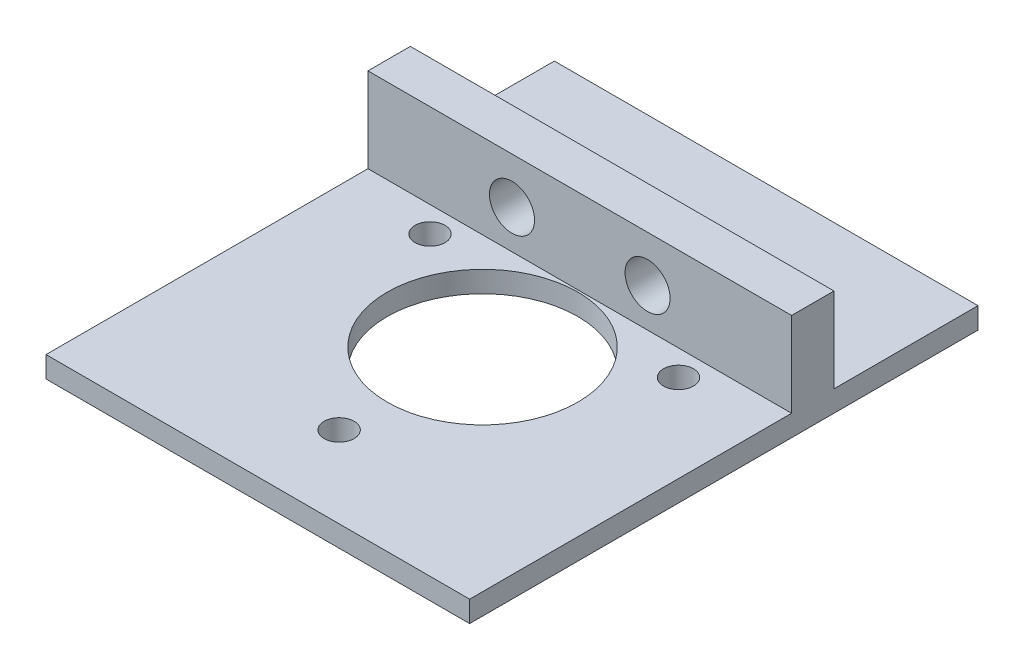
ISO-10303-21;
HEADER;
FILE_DESCRIPTION(('STEP AP214'),'2;1');
FILE_NAME('part.step','',(''),(''),'','','');
FILE_SCHEMA(('AUTOMOTIVE_DESIGN { 1 0 10303 214 1 1 1 1 }'));
ENDSEC;
DATA;
#1=APPLICATION_CONTEXT('core data for automotive mechanical design processes');
#2=APPLICATION_PROTOCOL_DEFINITION('international standard','automotive_design',2000,#1);
#3=PRODUCT_CONTEXT('',#1,'mechanical');
#4=PRODUCT('Part','Part','',(#3));
#5=PRODUCT_RELATED_PRODUCT_CATEGORY('part','',(#4));
#6=PRODUCT_DEFINITION_FORMATION('','',#4);
#7=PRODUCT_DEFINITION_CONTEXT('part definition',#1,'design');
#8=PRODUCT_DEFINITION('design','',#6,#7);
#9=PRODUCT_DEFINITION_SHAPE('','',#8);
#10=(LENGTH_UNIT() NAMED_UNIT(*) SI_UNIT(.MILLI.,.METRE.));
#11=(NAMED_UNIT(*) PLANE_ANGLE_UNIT() SI_UNIT($,.RADIAN.));
#12=(NAMED_UNIT(*) SI_UNIT($,.STERADIAN.) SOLID_ANGLE_UNIT());
#13=UNCERTAINTY_MEASURE_WITH_UNIT(LENGTH_MEASURE(1.E-05),#10,'distance_accuracy_value','');
#14=(GEOMETRIC_REPRESENTATION_CONTEXT(3) GLOBAL_UNCERTAINTY_ASSIGNED_CONTEXT((#13)) GLOBAL_UNIT_ASSIGNED_CONTEXT((#10,
#11,#12)) REPRESENTATION_CONTEXT('',''));
#15=CARTESIAN_POINT('',(0.,0.,0.));
#16=DIRECTION('',(0.,0.,1.));
#17=DIRECTION('',(1.,0.,0.));
#18=AXIS2_PLACEMENT_3D('',#15,#16,#17);
#19=CARTESIAN_POINT('',(63.5,0.,-76.2));
#20=DIRECTION('',(0.,1.,0.));
#21=DIRECTION('',(0.,0.,1.));
#22=AXIS2_PLACEMENT_3D('',#19,#20,#21);
#23=PLANE('',#22);
#24=CARTESIAN_POINT('',(31.75,0.,-12.1855537131404));
#25=DIRECTION('',(0.,-1.,0.));
#26=DIRECTION('',(0.,0.,-1.));
#27=AXIS2_PLACEMENT_3D('',#24,#25,#26);
#28=CIRCLE('',#27,2.25);
#29=CARTESIAN_POINT('',(31.75,0.,-14.4355537131404));
#30=VERTEX_POINT('',#29);
#31=EDGE_CURVE('E178',#30,#30,#28,.T.);
#32=ORIENTED_EDGE('',*,*,#31,.F.);
#33=EDGE_LOOP('',(#32));
#34=FACE_BOUND('',#33,.T.);
#35=CARTESIAN_POINT('',(50.36954618137,0.,-44.4355537131404));
#36=DIRECTION('',(0.,-1.,0.));
#37=DIRECTION('',(0.,0.,-1.));
#38=AXIS2_PLACEMENT_3D('',#35,#36,#37);
#39=CIRCLE('',#38,2.25);
#40=CARTESIAN_POINT('',(50.36954618137,0.,-46.6855537131404));
#41=VERTEX_POINT('',#40);
#42=EDGE_CURVE('E168',#41,#41,#39,.T.);
#43=ORIENTED_EDGE('',*,*,#42,.F.);
#44=EDGE_LOOP('',(#43));
#45=FACE_BOUND('',#44,.T.);
#46=CARTESIAN_POINT('',(13.13045381863,0.,-44.4355537131404));
#47=DIRECTION('',(0.,-1.,0.));
#48=DIRECTION('',(0.,0.,-1.));
#49=AXIS2_PLACEMENT_3D('',#46,#47,#48);
#50=CIRCLE('',#49,2.25);
#51=CARTESIAN_POINT('',(13.13045381863,0.,-46.6855537131404));
#52=VERTEX_POINT('',#51);
#53=EDGE_CURVE('E165',#52,#52,#50,.T.);
#54=ORIENTED_EDGE('',*,*,#53,.F.);
#55=EDGE_LOOP('',(#54));
#56=FACE_BOUND('',#55,.T.);
#57=CARTESIAN_POINT('',(31.75,0.,-33.6855537131404));
#58=DIRECTION('',(0.,1.,0.));
#59=DIRECTION('',(0.,0.,1.));
#60=AXIS2_PLACEMENT_3D('',#57,#58,#59);
#61=CIRCLE('',#60,14.2875);
#62=CARTESIAN_POINT('',(31.75,0.,-19.3980537131404));
#63=VERTEX_POINT('',#62);
#64=EDGE_CURVE('E139',#63,#63,#61,.T.);
#65=ORIENTED_EDGE('',*,*,#64,.T.);
#66=EDGE_LOOP('',(#65));
#67=FACE_BOUND('',#66,.T.);
#68=DIRECTION('',(0.,0.,-1.));
#69=VECTOR('',#68,1.);
#70=CARTESIAN_POINT('',(0.,0.,-76.2));
#71=LINE('',#70,#69);
#72=CARTESIAN_POINT('',(0.,0.,0.));
#73=VERTEX_POINT('',#72);
#74=CARTESIAN_POINT('',(0.,0.,-76.2));
#75=VERTEX_POINT('',#74);
#76=EDGE_CURVE('E135',#73,#75,#71,.T.);
#77=ORIENTED_EDGE('',*,*,#76,.T.);
#78=DIRECTION('',(-1.,0.,0.));
#79=VECTOR('',#78,1.);
#80=CARTESIAN_POINT('',(63.5,0.,-76.2));
#81=LINE('',#80,#79);
#82=CARTESIAN_POINT('',(63.5,0.,-76.2));
#83=VERTEX_POINT('',#82);
#84=EDGE_CURVE('E11',#83,#75,#81,.T.);
#85=ORIENTED_EDGE('',*,*,#84,.F.);
#86=DIRECTION('',(0.,0.,-1.));
#87=VECTOR('',#86,1.);
#88=CARTESIAN_POINT('',(63.5,0.,-76.2));
#89=LINE('',#88,#87);
#90=CARTESIAN_POINT('',(63.5,0.,0.));
#91=VERTEX_POINT('',#90);
#92=EDGE_CURVE('E150',#91,#83,#89,.T.);
#93=ORIENTED_EDGE('',*,*,#92,.F.);
#94=DIRECTION('',(-1.,0.,0.));
#95=VECTOR('',#94,1.);
#96=CARTESIAN_POINT('',(63.5,0.,0.));
#97=LINE('',#96,#95);
#98=EDGE_CURVE('E131',#91,#73,#97,.T.);
#99=ORIENTED_EDGE('',*,*,#98,.T.);
#100=EDGE_LOOP('',(#77,#85,#93,#99));
#101=FACE_BOUND('',#100,.T.);
#102=ADVANCED_FACE('F37',(#34,#45,#56,#67,#101),#23,.F.);
#103=CARTESIAN_POINT('',(63.5,3.175,-76.2));
#104=DIRECTION('',(0.,0.,1.));
#105=DIRECTION('',(1.,0.,0.));
#106=AXIS2_PLACEMENT_3D('',#103,#104,#105);
#107=PLANE('',#106);
#108=DIRECTION('',(0.,1.,0.));
#109=VECTOR('',#108,1.);
#110=CARTESIAN_POINT('',(0.,3.175,-76.2));
#111=LINE('',#110,#109);
#112=CARTESIAN_POINT('',(0.,3.175,-76.2));
#113=VERTEX_POINT('',#112);
#114=EDGE_CURVE('E138',#75,#113,#111,.T.);
#115=ORIENTED_EDGE('',*,*,#114,.T.);
#116=DIRECTION('',(-1.,0.,0.));
#117=VECTOR('',#116,1.);
#118=CARTESIAN_POINT('',(63.5,3.175,-76.2));
#119=LINE('',#118,#117);
#120=CARTESIAN_POINT('',(63.5,3.175,-76.2));
#121=VERTEX_POINT('',#120);
#122=EDGE_CURVE('E46',#121,#113,#119,.T.);
#123=ORIENTED_EDGE('',*,*,#122,.F.);
#124=DIRECTION('',(0.,1.,0.));
#125=VECTOR('',#124,1.);
#126=CARTESIAN_POINT('',(63.5,3.175,-76.2));
#127=LINE('',#126,#125);
#128=EDGE_CURVE('E98',#83,#121,#127,.T.);
#129=ORIENTED_EDGE('',*,*,#128,.F.);
#130=ORIENTED_EDGE('',*,*,#84,.T.);
#131=EDGE_LOOP('',(#115,#123,#129,#130));
#132=FACE_BOUND('',#131,.T.);
#133=ADVANCED_FACE('F220',(#132),#107,.F.);
#134=CARTESIAN_POINT('',(63.5,3.175,-54.61));
#135=DIRECTION('',(0.,-1.,0.));
#136=DIRECTION('',(0.,0.,-1.));
#137=AXIS2_PLACEMENT_3D('',#134,#135,#136);
#138=PLANE('',#137);
#139=DIRECTION('',(0.,0.,1.));
#140=VECTOR('',#139,1.);
#141=CARTESIAN_POINT('',(0.,3.175,-54.61));
#142=LINE('',#141,#140);
#143=CARTESIAN_POINT('',(0.,3.175,-54.61));
#144=VERTEX_POINT('',#143);
#145=EDGE_CURVE('E141',#113,#144,#142,.T.);
#146=ORIENTED_EDGE('',*,*,#145,.T.);
#147=DIRECTION('',(-1.,0.,0.));
#148=VECTOR('',#147,1.);
#149=CARTESIAN_POINT('',(63.5,3.175,-54.61));
#150=LINE('',#149,#148);
#151=CARTESIAN_POINT('',(63.5,3.175,-54.61));
#152=VERTEX_POINT('',#151);
#153=EDGE_CURVE('E157',#152,#144,#150,.T.);
#154=ORIENTED_EDGE('',*,*,#153,.F.);
#155=DIRECTION('',(0.,0.,1.));
#156=VECTOR('',#155,1.);
#157=CARTESIAN_POINT('',(63.5,3.175,-54.61));
#158=LINE('',#157,#156);
#159=EDGE_CURVE('E188',#121,#152,#158,.T.);
#160=ORIENTED_EDGE('',*,*,#159,.F.);
#161=ORIENTED_EDGE('',*,*,#122,.T.);
#162=EDGE_LOOP('',(#146,#154,#160,#161));
#163=FACE_BOUND('',#162,.T.);
#164=ADVANCED_FACE('F225',(#163),#138,.F.);
#165=CARTESIAN_POINT('',(63.5,15.875,-54.61));
#166=DIRECTION('',(0.,0.,1.));
#167=DIRECTION('',(1.,0.,0.));
#168=AXIS2_PLACEMENT_3D('',#165,#166,#167);
#169=PLANE('',#168);
#170=CARTESIAN_POINT('',(41.91,8.96619999999999,-54.61));
#171=DIRECTION('',(0.,0.,1.));
#172=DIRECTION('',(1.,0.,0.));
#173=AXIS2_PLACEMENT_3D('',#170,#171,#172);
#174=CIRCLE('',#173,3.37819999999999);
#175=CARTESIAN_POINT('',(45.2882,8.96619999999999,-54.61));
#176=VERTEX_POINT('',#175);
#177=EDGE_CURVE('E270',#176,#176,#174,.T.);
#178=ORIENTED_EDGE('',*,*,#177,.T.);
#179=EDGE_LOOP('',(#178));
#180=FACE_BOUND('',#179,.T.);
#181=CARTESIAN_POINT('',(21.59,8.96619999999999,-54.61));
#182=DIRECTION('',(0.,0.,1.));
#183=DIRECTION('',(1.,0.,0.));
#184=AXIS2_PLACEMENT_3D('',#181,#182,#183);
#185=CIRCLE('',#184,3.3782);
#186=CARTESIAN_POINT('',(24.9682,8.96619999999999,-54.61));
#187=VERTEX_POINT('',#186);
#188=EDGE_CURVE('E275',#187,#187,#185,.T.);
#189=ORIENTED_EDGE('',*,*,#188,.T.);
#190=EDGE_LOOP('',(#189));
#191=FACE_BOUND('',#190,.T.);
#192=DIRECTION('',(0.,1.,0.));
#193=VECTOR('',#192,1.);
#194=CARTESIAN_POINT('',(0.,15.875,-54.61));
#195=LINE('',#194,#193);
#196=CARTESIAN_POINT('',(0.,15.875,-54.61));
#197=VERTEX_POINT('',#196);
#198=EDGE_CURVE('E143',#144,#197,#195,.T.);
#199=ORIENTED_EDGE('',*,*,#198,.T.);
#200=DIRECTION('',(-1.,0.,0.));
#201=VECTOR('',#200,1.);
#202=CARTESIAN_POINT('',(63.5,15.875,-54.61));
#203=LINE('',#202,#201);
#204=CARTESIAN_POINT('',(63.5,15.875,-54.61));
#205=VERTEX_POINT('',#204);
#206=EDGE_CURVE('E154',#205,#197,#203,.T.);
#207=ORIENTED_EDGE('',*,*,#206,.F.);
#208=DIRECTION('',(0.,1.,0.));
#209=VECTOR('',#208,1.);
#210=CARTESIAN_POINT('',(63.5,15.875,-54.61));
#211=LINE('',#210,#209);
#212=EDGE_CURVE('E190',#152,#205,#211,.T.);
#213=ORIENTED_EDGE('',*,*,#212,.F.);
#214=ORIENTED_EDGE('',*,*,#153,.T.);
#215=EDGE_LOOP('',(#199,#207,#213,#214));
#216=FACE_BOUND('',#215,.T.);
#217=ADVANCED_FACE('F196',(#180,#191,#216),#169,.F.);
#218=CARTESIAN_POINT('',(63.5,15.875,-48.26));
#219=DIRECTION('',(0.,-1.,0.));
#220=DIRECTION('',(0.,0.,-1.));
#221=AXIS2_PLACEMENT_3D('',#218,#219,#220);
#222=PLANE('',#221);
#223=DIRECTION('',(0.,0.,1.));
#224=VECTOR('',#223,1.);
#225=CARTESIAN_POINT('',(0.,15.875,-48.26));
#226=LINE('',#225,#224);
#227=CARTESIAN_POINT('',(0.,15.875,-48.26));
#228=VERTEX_POINT('',#227);
#229=EDGE_CURVE('E145',#197,#228,#226,.T.);
#230=ORIENTED_EDGE('',*,*,#229,.T.);
#231=DIRECTION('',(-1.,0.,0.));
#232=VECTOR('',#231,1.);
#233=CARTESIAN_POINT('',(63.5,15.875,-48.26));
#234=LINE('',#233,#232);
#235=CARTESIAN_POINT('',(63.5,15.875,-48.26));
#236=VERTEX_POINT('',#235);
#237=EDGE_CURVE('E126',#236,#228,#234,.T.);
#238=ORIENTED_EDGE('',*,*,#237,.F.);
#239=DIRECTION('',(0.,0.,1.));
#240=VECTOR('',#239,1.);
#241=CARTESIAN_POINT('',(63.5,15.875,-48.26));
#242=LINE('',#241,#240);
#243=EDGE_CURVE('E117',#205,#236,#242,.T.);
#244=ORIENTED_EDGE('',*,*,#243,.F.);
#245=ORIENTED_EDGE('',*,*,#206,.T.);
#246=EDGE_LOOP('',(#230,#238,#244,#245));
#247=FACE_BOUND('',#246,.T.);
#248=ADVANCED_FACE('F200',(#247),#222,.F.);
#249=CARTESIAN_POINT('',(63.5,3.17500000000001,-48.26));
#250=DIRECTION('',(0.,0.,-1.));
#251=DIRECTION('',(-1.,0.,0.));
#252=AXIS2_PLACEMENT_3D('',#249,#250,#251);
#253=PLANE('',#252);
#254=CARTESIAN_POINT('',(41.91,8.96619999999999,-48.26));
#255=DIRECTION('',(0.,0.,1.));
#256=DIRECTION('',(1.,0.,0.));
#257=AXIS2_PLACEMENT_3D('',#254,#255,#256);
#258=CIRCLE('',#257,3.3782);
#259=CARTESIAN_POINT('',(45.2882,8.96619999999999,-48.26));
#260=VERTEX_POINT('',#259);
#261=EDGE_CURVE('E267',#260,#260,#258,.T.);
#262=ORIENTED_EDGE('',*,*,#261,.F.);
#263=EDGE_LOOP('',(#262));
#264=FACE_BOUND('',#263,.T.);
#265=CARTESIAN_POINT('',(21.59,8.96619999999999,-48.26));
#266=DIRECTION('',(0.,0.,1.));
#267=DIRECTION('',(1.,0.,0.));
#268=AXIS2_PLACEMENT_3D('',#265,#266,#267);
#269=CIRCLE('',#268,3.3782);
#270=CARTESIAN_POINT('',(24.9682,8.96619999999999,-48.26));
#271=VERTEX_POINT('',#270);
#272=EDGE_CURVE('E272',#271,#271,#269,.T.);
#273=ORIENTED_EDGE('',*,*,#272,.F.);
#274=EDGE_LOOP('',(#273));
#275=FACE_BOUND('',#274,.T.);
#276=DIRECTION('',(0.,-1.,0.));
#277=VECTOR('',#276,1.);
#278=CARTESIAN_POINT('',(0.,3.17500000000001,-48.26));
#279=LINE('',#278,#277);
#280=CARTESIAN_POINT('',(0.,3.17500000000001,-48.26));
#281=VERTEX_POINT('',#280);
#282=EDGE_CURVE('E125',#228,#281,#279,.T.);
#283=ORIENTED_EDGE('',*,*,#282,.T.);
#284=DIRECTION('',(-1.,0.,0.));
#285=VECTOR('',#284,1.);
#286=CARTESIAN_POINT('',(63.5,3.17500000000001,-48.26));
#287=LINE('',#286,#285);
#288=CARTESIAN_POINT('',(63.5,3.17500000000001,-48.26));
#289=VERTEX_POINT('',#288);
#290=EDGE_CURVE('E122',#289,#281,#287,.T.);
#291=ORIENTED_EDGE('',*,*,#290,.F.);
#292=DIRECTION('',(0.,-1.,0.));
#293=VECTOR('',#292,1.);
#294=CARTESIAN_POINT('',(63.5,3.17500000000001,-48.26));
#295=LINE('',#294,#293);
#296=EDGE_CURVE('E111',#236,#289,#295,.T.);
#297=ORIENTED_EDGE('',*,*,#296,.F.);
#298=ORIENTED_EDGE('',*,*,#237,.T.);
#299=EDGE_LOOP('',(#283,#291,#297,#298));
#300=FACE_BOUND('',#299,.T.);
#301=ADVANCED_FACE('F123',(#264,#275,#300),#253,.F.);
#302=CARTESIAN_POINT('',(63.5,3.175,0.));
#303=DIRECTION('',(0.,-1.,0.));
#304=DIRECTION('',(0.,0.,-1.));
#305=AXIS2_PLACEMENT_3D('',#302,#303,#304);
#306=PLANE('',#305);
#307=CARTESIAN_POINT('',(31.75,3.175,-12.1855537131404));
#308=DIRECTION('',(0.,-1.,0.));
#309=DIRECTION('',(0.,0.,-1.));
#310=AXIS2_PLACEMENT_3D('',#307,#308,#309);
#311=CIRCLE('',#310,2.25);
#312=CARTESIAN_POINT('',(31.75,3.175,-14.4355537131404));
#313=VERTEX_POINT('',#312);
#314=EDGE_CURVE('E40',#313,#313,#311,.T.);
#315=ORIENTED_EDGE('',*,*,#314,.T.);
#316=EDGE_LOOP('',(#315));
#317=FACE_BOUND('',#316,.T.);
#318=CARTESIAN_POINT('',(50.36954618137,3.17500000000001,-44.4355537131404));
#319=DIRECTION('',(0.,-1.,0.));
#320=DIRECTION('',(0.,0.,-1.));
#321=AXIS2_PLACEMENT_3D('',#318,#319,#320);
#322=CIRCLE('',#321,2.25);
#323=CARTESIAN_POINT('',(50.36954618137,3.17500000000001,-46.6855537131404));
#324=VERTEX_POINT('',#323);
#325=EDGE_CURVE('E166',#324,#324,#322,.T.);
#326=ORIENTED_EDGE('',*,*,#325,.T.);
#327=EDGE_LOOP('',(#326));
#328=FACE_BOUND('',#327,.T.);
#329=CARTESIAN_POINT('',(13.13045381863,3.17500000000001,-44.4355537131404));
#330=DIRECTION('',(0.,-1.,0.));
#331=DIRECTION('',(0.,0.,-1.));
#332=AXIS2_PLACEMENT_3D('',#329,#330,#331);
#333=CIRCLE('',#332,2.25);
#334=CARTESIAN_POINT('',(13.13045381863,3.17500000000001,-46.6855537131404));
#335=VERTEX_POINT('',#334);
#336=EDGE_CURVE('E162',#335,#335,#333,.T.);
#337=ORIENTED_EDGE('',*,*,#336,.T.);
#338=EDGE_LOOP('',(#337));
#339=FACE_BOUND('',#338,.T.);
#340=CARTESIAN_POINT('',(31.75,3.175,-33.6855537131404));
#341=DIRECTION('',(0.,1.,0.));
#342=DIRECTION('',(0.,0.,1.));
#343=AXIS2_PLACEMENT_3D('',#340,#341,#342);
#344=CIRCLE('',#343,14.2875);
#345=CARTESIAN_POINT('',(31.75,3.175,-19.3980537131404));
#346=VERTEX_POINT('',#345);
#347=EDGE_CURVE('E164',#346,#346,#344,.T.);
#348=ORIENTED_EDGE('',*,*,#347,.F.);
#349=EDGE_LOOP('',(#348));
#350=FACE_BOUND('',#349,.T.);
#351=DIRECTION('',(0.,0.,1.));
#352=VECTOR('',#351,1.);
#353=CARTESIAN_POINT('',(0.,3.175,0.));
#354=LINE('',#353,#352);
#355=CARTESIAN_POINT('',(0.,3.175,0.));
#356=VERTEX_POINT('',#355);
#357=EDGE_CURVE('E84',#281,#356,#354,.T.);
#358=ORIENTED_EDGE('',*,*,#357,.T.);
#359=DIRECTION('',(-1.,0.,0.));
#360=VECTOR('',#359,1.);
#361=CARTESIAN_POINT('',(63.5,3.175,0.));
#362=LINE('',#361,#360);
#363=CARTESIAN_POINT('',(63.5,3.175,0.));
#364=VERTEX_POINT('',#363);
#365=EDGE_CURVE('E127',#364,#356,#362,.T.);
#366=ORIENTED_EDGE('',*,*,#365,.F.);
#367=DIRECTION('',(0.,0.,1.));
#368=VECTOR('',#367,1.);
#369=CARTESIAN_POINT('',(63.5,3.175,0.));
#370=LINE('',#369,#368);
#371=EDGE_CURVE('E115',#289,#364,#370,.T.);
#372=ORIENTED_EDGE('',*,*,#371,.F.);
#373=ORIENTED_EDGE('',*,*,#290,.T.);
#374=EDGE_LOOP('',(#358,#366,#372,#373));
#375=FACE_BOUND('',#374,.T.);
#376=ADVANCED_FACE('F129',(#317,#328,#339,#350,#375),#306,.F.);
#377=CARTESIAN_POINT('',(63.5,0.,0.));
#378=DIRECTION('',(0.,0.,-1.));
#379=DIRECTION('',(-1.,0.,0.));
#380=AXIS2_PLACEMENT_3D('',#377,#378,#379);
#381=PLANE('',#380);
#382=DIRECTION('',(0.,-1.,0.));
#383=VECTOR('',#382,1.);
#384=CARTESIAN_POINT('',(0.,0.,0.));
#385=LINE('',#384,#383);
#386=EDGE_CURVE('E90',#356,#73,#385,.T.);
#387=ORIENTED_EDGE('',*,*,#386,.T.);
#388=ORIENTED_EDGE('',*,*,#98,.F.);
#389=DIRECTION('',(0.,-1.,0.));
#390=VECTOR('',#389,1.);
#391=CARTESIAN_POINT('',(63.5,0.,0.));
#392=LINE('',#391,#390);
#393=EDGE_CURVE('E55',#364,#91,#392,.T.);
#394=ORIENTED_EDGE('',*,*,#393,.F.);
#395=ORIENTED_EDGE('',*,*,#365,.T.);
#396=EDGE_LOOP('',(#387,#388,#394,#395));
#397=FACE_BOUND('',#396,.T.);
#398=ADVANCED_FACE('F208',(#397),#381,.F.);
#399=CARTESIAN_POINT('',(63.5,0.,0.));
#400=DIRECTION('',(-1.,0.,0.));
#401=DIRECTION('',(0.,0.,1.));
#402=AXIS2_PLACEMENT_3D('',#399,#400,#401);
#403=PLANE('',#402);
#404=ORIENTED_EDGE('',*,*,#92,.T.);
#405=ORIENTED_EDGE('',*,*,#128,.T.);
#406=ORIENTED_EDGE('',*,*,#159,.T.);
#407=ORIENTED_EDGE('',*,*,#212,.T.);
#408=ORIENTED_EDGE('',*,*,#243,.T.);
#409=ORIENTED_EDGE('',*,*,#296,.T.);
#410=ORIENTED_EDGE('',*,*,#371,.T.);
#411=ORIENTED_EDGE('',*,*,#393,.T.);
#412=EDGE_LOOP('',(#404,#405,#406,#407,#408,#409,#410,#411));
#413=FACE_BOUND('',#412,.T.);
#414=ADVANCED_FACE('F113',(#413),#403,.F.);
#415=CARTESIAN_POINT('',(0.,0.,0.));
#416=DIRECTION('',(-1.,0.,0.));
#417=DIRECTION('',(0.,0.,1.));
#418=AXIS2_PLACEMENT_3D('',#415,#416,#417);
#419=PLANE('',#418);
#420=ORIENTED_EDGE('',*,*,#76,.F.);
#421=ORIENTED_EDGE('',*,*,#386,.F.);
#422=ORIENTED_EDGE('',*,*,#357,.F.);
#423=ORIENTED_EDGE('',*,*,#282,.F.);
#424=ORIENTED_EDGE('',*,*,#229,.F.);
#425=ORIENTED_EDGE('',*,*,#198,.F.);
#426=ORIENTED_EDGE('',*,*,#145,.F.);
#427=ORIENTED_EDGE('',*,*,#114,.F.);
#428=EDGE_LOOP('',(#420,#421,#422,#423,#424,#425,#426,#427));
#429=FACE_BOUND('',#428,.T.);
#430=ADVANCED_FACE('F203',(#429),#419,.T.);
#431=CARTESIAN_POINT('',(31.75,0.,-33.6855537131404));
#432=DIRECTION('',(0.,1.,0.));
#433=DIRECTION('',(0.,0.,1.));
#434=AXIS2_PLACEMENT_3D('',#431,#432,#433);
#435=CYLINDRICAL_SURFACE('',#434,14.2875);
#436=ORIENTED_EDGE('',*,*,#64,.F.);
#437=EDGE_LOOP('',(#436));
#438=FACE_BOUND('',#437,.T.);
#439=ORIENTED_EDGE('',*,*,#347,.T.);
#440=EDGE_LOOP('',(#439));
#441=FACE_BOUND('',#440,.T.);
#442=ADVANCED_FACE('F234',(#438,#441),#435,.F.);
#443=CARTESIAN_POINT('',(13.13045381863,0.,-44.4355537131404));
#444=DIRECTION('',(0.,-1.,0.));
#445=DIRECTION('',(0.,0.,-1.));
#446=AXIS2_PLACEMENT_3D('',#443,#444,#445);
#447=CYLINDRICAL_SURFACE('',#446,2.25);
#448=ORIENTED_EDGE('',*,*,#53,.T.);
#449=EDGE_LOOP('',(#448));
#450=FACE_BOUND('',#449,.T.);
#451=ORIENTED_EDGE('',*,*,#336,.F.);
#452=EDGE_LOOP('',(#451));
#453=FACE_BOUND('',#452,.T.);
#454=ADVANCED_FACE('F237',(#450,#453),#447,.F.);
#455=CARTESIAN_POINT('',(50.36954618137,0.,-44.4355537131404));
#456=DIRECTION('',(0.,-1.,0.));
#457=DIRECTION('',(0.,0.,-1.));
#458=AXIS2_PLACEMENT_3D('',#455,#456,#457);
#459=CYLINDRICAL_SURFACE('',#458,2.25);
#460=ORIENTED_EDGE('',*,*,#42,.T.);
#461=EDGE_LOOP('',(#460));
#462=FACE_BOUND('',#461,.T.);
#463=ORIENTED_EDGE('',*,*,#325,.F.);
#464=EDGE_LOOP('',(#463));
#465=FACE_BOUND('',#464,.T.);
#466=ADVANCED_FACE('F245',(#462,#465),#459,.F.);
#467=CARTESIAN_POINT('',(31.75,0.,-12.1855537131404));
#468=DIRECTION('',(0.,-1.,0.));
#469=DIRECTION('',(0.,0.,-1.));
#470=AXIS2_PLACEMENT_3D('',#467,#468,#469);
#471=CYLINDRICAL_SURFACE('',#470,2.25);
#472=ORIENTED_EDGE('',*,*,#31,.T.);
#473=EDGE_LOOP('',(#472));
#474=FACE_BOUND('',#473,.T.);
#475=ORIENTED_EDGE('',*,*,#314,.F.);
#476=EDGE_LOOP('',(#475));
#477=FACE_BOUND('',#476,.T.);
#478=ADVANCED_FACE('F251',(#474,#477),#471,.F.);
#479=CARTESIAN_POINT('',(21.59,8.96619999999999,-48.26));
#480=DIRECTION('',(0.,0.,1.));
#481=DIRECTION('',(1.,0.,0.));
#482=AXIS2_PLACEMENT_3D('',#479,#480,#481);
#483=CYLINDRICAL_SURFACE('',#482,3.3782);
#484=ORIENTED_EDGE('',*,*,#272,.T.);
#485=EDGE_LOOP('',(#484));
#486=FACE_BOUND('',#485,.T.);
#487=ORIENTED_EDGE('',*,*,#188,.F.);
#488=EDGE_LOOP('',(#487));
#489=FACE_BOUND('',#488,.T.);
#490=ADVANCED_FACE('F254',(#486,#489),#483,.F.);
#491=CARTESIAN_POINT('',(41.91,8.96619999999999,-48.26));
#492=DIRECTION('',(0.,0.,1.));
#493=DIRECTION('',(1.,0.,0.));
#494=AXIS2_PLACEMENT_3D('',#491,#492,#493);
#495=CYLINDRICAL_SURFACE('',#494,3.37819999999999);
#496=ORIENTED_EDGE('',*,*,#261,.T.);
#497=EDGE_LOOP('',(#496));
#498=FACE_BOUND('',#497,.T.);
#499=ORIENTED_EDGE('',*,*,#177,.F.);
#500=EDGE_LOOP('',(#499));
#501=FACE_BOUND('',#500,.T.);
#502=ADVANCED_FACE('F258',(#498,#501),#495,.F.);
#503=CLOSED_SHELL('',(#102,#133,#164,#217,#248,#301,#376,#398,#414,#430,#442,#454,#466,#478,
#490,#502));
#504=MANIFOLD_SOLID_BREP('B2',#503);
#505=ADVANCED_BREP_SHAPE_REPRESENTATION('',(#18,#504),#14);
#506=SHAPE_DEFINITION_REPRESENTATION(#9,#505);
ENDSEC;
END-ISO-10303-21;
